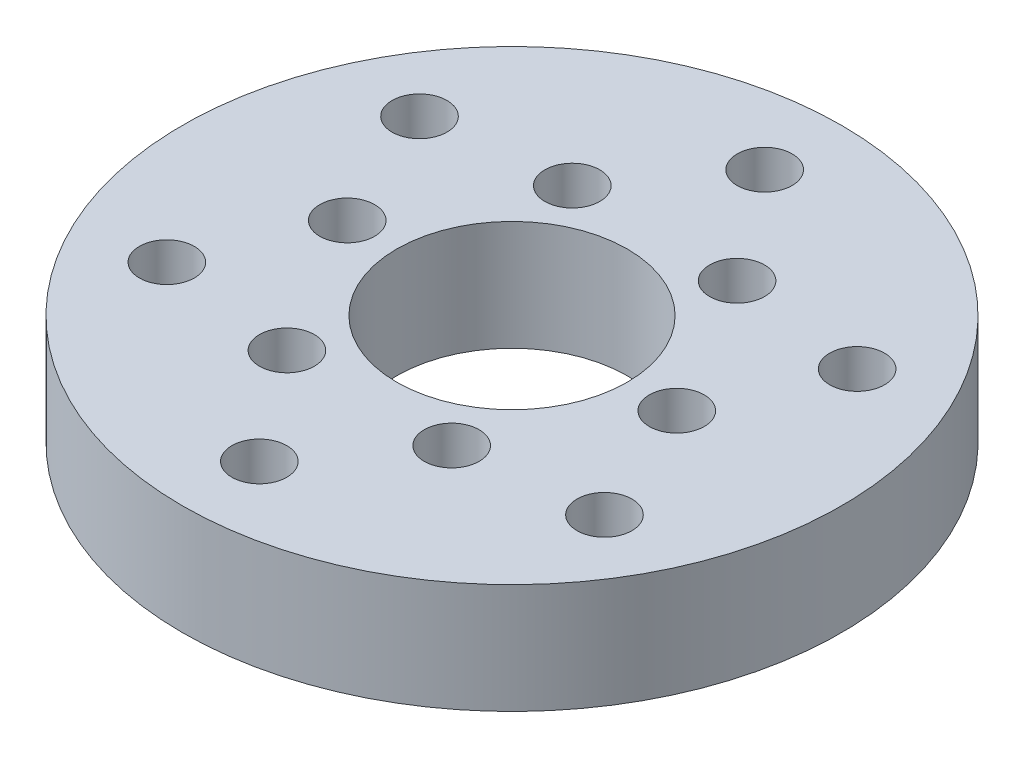
ISO-10303-21;
HEADER;
FILE_DESCRIPTION(('STEP AP214'),'2;1');
FILE_NAME('part.step','',(''),(''),'','','');
FILE_SCHEMA(('AUTOMOTIVE_DESIGN { 1 0 10303 214 1 1 1 1 }'));
ENDSEC;
DATA;
#1=APPLICATION_CONTEXT('core data for automotive mechanical design processes');
#2=APPLICATION_PROTOCOL_DEFINITION('international standard','automotive_design',2000,#1);
#3=PRODUCT_CONTEXT('',#1,'mechanical');
#4=PRODUCT('Part','Part','',(#3));
#5=PRODUCT_RELATED_PRODUCT_CATEGORY('part','',(#4));
#6=PRODUCT_DEFINITION_FORMATION('','',#4);
#7=PRODUCT_DEFINITION_CONTEXT('part definition',#1,'design');
#8=PRODUCT_DEFINITION('design','',#6,#7);
#9=PRODUCT_DEFINITION_SHAPE('','',#8);
#10=(LENGTH_UNIT() NAMED_UNIT(*) SI_UNIT(.MILLI.,.METRE.));
#11=(NAMED_UNIT(*) PLANE_ANGLE_UNIT() SI_UNIT($,.RADIAN.));
#12=(NAMED_UNIT(*) SI_UNIT($,.STERADIAN.) SOLID_ANGLE_UNIT());
#13=UNCERTAINTY_MEASURE_WITH_UNIT(LENGTH_MEASURE(1.E-05),#10,'distance_accuracy_value','');
#14=(GEOMETRIC_REPRESENTATION_CONTEXT(3) GLOBAL_UNCERTAINTY_ASSIGNED_CONTEXT((#13)) GLOBAL_UNIT_ASSIGNED_CONTEXT((#10,
#11,#12)) REPRESENTATION_CONTEXT('',''));
#15=CARTESIAN_POINT('',(0.,0.,0.));
#16=DIRECTION('',(0.,0.,1.));
#17=DIRECTION('',(1.,0.,0.));
#18=AXIS2_PLACEMENT_3D('',#15,#16,#17);
#19=CARTESIAN_POINT('',(0.,10.,0.));
#20=DIRECTION('',(0.,1.,0.));
#21=DIRECTION('',(0.,0.,1.));
#22=AXIS2_PLACEMENT_3D('',#19,#20,#21);
#23=PLANE('',#22);
#24=CARTESIAN_POINT('',(-14.9999999999995,10.,3.01429200709531E-13));
#25=DIRECTION('',(0.,1.,0.));
#26=DIRECTION('',(0.,0.,1.));
#27=AXIS2_PLACEMENT_3D('',#24,#25,#26);
#28=CIRCLE('',#27,2.5);
#29=CARTESIAN_POINT('',(-14.9999999999995,10.,2.5000000000003));
#30=VERTEX_POINT('',#29);
#31=EDGE_CURVE('E92',#30,#30,#28,.T.);
#32=ORIENTED_EDGE('',*,*,#31,.F.);
#33=EDGE_LOOP('',(#32));
#34=FACE_BOUND('',#33,.T.);
#35=CARTESIAN_POINT('',(-7.49999999999893,10.,12.9903810567666));
#36=DIRECTION('',(0.,1.,0.));
#37=DIRECTION('',(0.,0.,1.));
#38=AXIS2_PLACEMENT_3D('',#35,#36,#37);
#39=CIRCLE('',#38,2.5);
#40=CARTESIAN_POINT('',(-7.49999999999893,10.,15.4903810567666));
#41=VERTEX_POINT('',#40);
#42=EDGE_CURVE('E98',#41,#41,#39,.T.);
#43=ORIENTED_EDGE('',*,*,#42,.F.);
#44=EDGE_LOOP('',(#43));
#45=FACE_BOUND('',#44,.T.);
#46=CARTESIAN_POINT('',(7.50000000000108,10.,12.990381056766));
#47=DIRECTION('',(0.,1.,0.));
#48=DIRECTION('',(0.,0.,1.));
#49=AXIS2_PLACEMENT_3D('',#46,#47,#48);
#50=CIRCLE('',#49,2.5);
#51=CARTESIAN_POINT('',(7.50000000000108,10.,15.490381056766));
#52=VERTEX_POINT('',#51);
#53=EDGE_CURVE('E104',#52,#52,#50,.T.);
#54=ORIENTED_EDGE('',*,*,#53,.F.);
#55=EDGE_LOOP('',(#54));
#56=FACE_BOUND('',#55,.T.);
#57=CARTESIAN_POINT('',(15.0000000000006,10.,-9.13786587729344E-13));
#58=DIRECTION('',(0.,1.,0.));
#59=DIRECTION('',(0.,0.,1.));
#60=AXIS2_PLACEMENT_3D('',#57,#58,#59);
#61=CIRCLE('',#60,2.5);
#62=CARTESIAN_POINT('',(15.0000000000006,10.,2.49999999999909));
#63=VERTEX_POINT('',#62);
#64=EDGE_CURVE('E110',#63,#63,#61,.T.);
#65=ORIENTED_EDGE('',*,*,#64,.F.);
#66=EDGE_LOOP('',(#65));
#67=FACE_BOUND('',#66,.T.);
#68=CARTESIAN_POINT('',(7.50000000000003,10.,-12.9903810567672));
#69=DIRECTION('',(0.,1.,0.));
#70=DIRECTION('',(0.,0.,1.));
#71=AXIS2_PLACEMENT_3D('',#68,#69,#70);
#72=CIRCLE('',#71,2.5);
#73=CARTESIAN_POINT('',(7.50000000000003,10.,-10.4903810567672));
#74=VERTEX_POINT('',#73);
#75=EDGE_CURVE('E116',#74,#74,#72,.T.);
#76=ORIENTED_EDGE('',*,*,#75,.F.);
#77=EDGE_LOOP('',(#76));
#78=FACE_BOUND('',#77,.T.);
#79=CARTESIAN_POINT('',(-7.49999999999997,10.,-12.9903810567666));
#80=DIRECTION('',(0.,1.,0.));
#81=DIRECTION('',(0.,0.,1.));
#82=AXIS2_PLACEMENT_3D('',#79,#80,#81);
#83=CIRCLE('',#82,2.5);
#84=CARTESIAN_POINT('',(-7.49999999999997,10.,-10.4903810567666));
#85=VERTEX_POINT('',#84);
#86=EDGE_CURVE('E86',#85,#85,#83,.T.);
#87=ORIENTED_EDGE('',*,*,#86,.F.);
#88=EDGE_LOOP('',(#87));
#89=FACE_BOUND('',#88,.T.);
#90=CARTESIAN_POINT('',(-19.9185842870405,10.,11.5000000000009));
#91=DIRECTION('',(0.,1.,0.));
#92=DIRECTION('',(0.,0.,1.));
#93=AXIS2_PLACEMENT_3D('',#90,#91,#92);
#94=CIRCLE('',#93,2.50000000000087);
#95=CARTESIAN_POINT('',(-19.9185842870405,10.,14.0000000000018));
#96=VERTEX_POINT('',#95);
#97=EDGE_CURVE('E71',#96,#96,#94,.T.);
#98=ORIENTED_EDGE('',*,*,#97,.F.);
#99=EDGE_LOOP('',(#98));
#100=FACE_BOUND('',#99,.T.);
#101=CARTESIAN_POINT('',(19.9185842870437,10.,11.4999999999991));
#102=DIRECTION('',(0.,1.,0.));
#103=DIRECTION('',(0.,0.,1.));
#104=AXIS2_PLACEMENT_3D('',#101,#102,#103);
#105=CIRCLE('',#104,2.50000000000034);
#106=CARTESIAN_POINT('',(19.9185842870437,10.,13.9999999999994));
#107=VERTEX_POINT('',#106);
#108=EDGE_CURVE('E59',#107,#107,#105,.T.);
#109=ORIENTED_EDGE('',*,*,#108,.F.);
#110=EDGE_LOOP('',(#109));
#111=FACE_BOUND('',#110,.T.);
#112=CARTESIAN_POINT('',(0.,10.,0.));
#113=DIRECTION('',(0.,1.,0.));
#114=DIRECTION('',(0.,0.,1.));
#115=AXIS2_PLACEMENT_3D('',#112,#113,#114);
#116=CIRCLE('',#115,10.5);
#117=CARTESIAN_POINT('',(0.,10.,10.5));
#118=VERTEX_POINT('',#117);
#119=EDGE_CURVE('E47',#118,#118,#116,.T.);
#120=ORIENTED_EDGE('',*,*,#119,.F.);
#121=EDGE_LOOP('',(#120));
#122=FACE_BOUND('',#121,.T.);
#123=CARTESIAN_POINT('',(0.,10.,0.));
#124=DIRECTION('',(0.,1.,0.));
#125=DIRECTION('',(0.,0.,1.));
#126=AXIS2_PLACEMENT_3D('',#123,#124,#125);
#127=CIRCLE('',#126,30.);
#128=CARTESIAN_POINT('',(0.,10.,30.));
#129=VERTEX_POINT('',#128);
#130=EDGE_CURVE('E10',#129,#129,#127,.T.);
#131=ORIENTED_EDGE('',*,*,#130,.T.);
#132=EDGE_LOOP('',(#131));
#133=FACE_BOUND('',#132,.T.);
#134=CARTESIAN_POINT('',(0.,10.,-23.));
#135=DIRECTION('',(0.,1.,0.));
#136=DIRECTION('',(0.,0.,1.));
#137=AXIS2_PLACEMENT_3D('',#134,#135,#136);
#138=CIRCLE('',#137,2.5);
#139=CARTESIAN_POINT('',(0.,10.,-20.5));
#140=VERTEX_POINT('',#139);
#141=EDGE_CURVE('E42',#140,#140,#138,.T.);
#142=ORIENTED_EDGE('',*,*,#141,.F.);
#143=EDGE_LOOP('',(#142));
#144=FACE_BOUND('',#143,.T.);
#145=CARTESIAN_POINT('',(19.9185842870426,10.,-11.5000000000009));
#146=DIRECTION('',(0.,1.,0.));
#147=DIRECTION('',(0.,0.,1.));
#148=AXIS2_PLACEMENT_3D('',#145,#146,#147);
#149=CIRCLE('',#148,2.50000000000024);
#150=CARTESIAN_POINT('',(19.9185842870426,10.,-9.0000000000007));
#151=VERTEX_POINT('',#150);
#152=EDGE_CURVE('E53',#151,#151,#149,.T.);
#153=ORIENTED_EDGE('',*,*,#152,.F.);
#154=EDGE_LOOP('',(#153));
#155=FACE_BOUND('',#154,.T.);
#156=CARTESIAN_POINT('',(2.16458606171264E-12,10.,23.));
#157=DIRECTION('',(0.,1.,0.));
#158=DIRECTION('',(0.,0.,1.));
#159=AXIS2_PLACEMENT_3D('',#156,#157,#158);
#160=CIRCLE('',#159,2.50000000000058);
#161=CARTESIAN_POINT('',(2.16458606171264E-12,10.,25.5000000000006));
#162=VERTEX_POINT('',#161);
#163=EDGE_CURVE('E65',#162,#162,#160,.T.);
#164=ORIENTED_EDGE('',*,*,#163,.F.);
#165=EDGE_LOOP('',(#164));
#166=FACE_BOUND('',#165,.T.);
#167=CARTESIAN_POINT('',(-19.9185842870416,10.,-11.499999999999));
#168=DIRECTION('',(0.,1.,0.));
#169=DIRECTION('',(0.,0.,1.));
#170=AXIS2_PLACEMENT_3D('',#167,#168,#169);
#171=CIRCLE('',#170,2.50000000000119);
#172=CARTESIAN_POINT('',(-19.9185842870416,10.,-8.99999999999786));
#173=VERTEX_POINT('',#172);
#174=EDGE_CURVE('E77',#173,#173,#171,.T.);
#175=ORIENTED_EDGE('',*,*,#174,.F.);
#176=EDGE_LOOP('',(#175));
#177=FACE_BOUND('',#176,.T.);
#178=ADVANCED_FACE('F31',(#34,#45,#56,#67,#78,#89,#100,#111,#122,#133,#144,#155,#166,#177),#23,.T.);
#179=CARTESIAN_POINT('',(0.,0.,0.));
#180=DIRECTION('',(0.,1.,0.));
#181=DIRECTION('',(0.,0.,1.));
#182=AXIS2_PLACEMENT_3D('',#179,#180,#181);
#183=PLANE('',#182);
#184=CARTESIAN_POINT('',(-14.9999999999995,0.,3.01429200709531E-13));
#185=DIRECTION('',(0.,1.,0.));
#186=DIRECTION('',(0.,0.,1.));
#187=AXIS2_PLACEMENT_3D('',#184,#185,#186);
#188=CIRCLE('',#187,2.5);
#189=CARTESIAN_POINT('',(-14.9999999999995,0.,2.5000000000003));
#190=VERTEX_POINT('',#189);
#191=EDGE_CURVE('E95',#190,#190,#188,.T.);
#192=ORIENTED_EDGE('',*,*,#191,.T.);
#193=EDGE_LOOP('',(#192));
#194=FACE_BOUND('',#193,.T.);
#195=CARTESIAN_POINT('',(-7.49999999999893,0.,12.9903810567666));
#196=DIRECTION('',(0.,1.,0.));
#197=DIRECTION('',(0.,0.,1.));
#198=AXIS2_PLACEMENT_3D('',#195,#196,#197);
#199=CIRCLE('',#198,2.5);
#200=CARTESIAN_POINT('',(-7.49999999999893,0.,15.4903810567666));
#201=VERTEX_POINT('',#200);
#202=EDGE_CURVE('E101',#201,#201,#199,.T.);
#203=ORIENTED_EDGE('',*,*,#202,.T.);
#204=EDGE_LOOP('',(#203));
#205=FACE_BOUND('',#204,.T.);
#206=CARTESIAN_POINT('',(7.50000000000108,0.,12.990381056766));
#207=DIRECTION('',(0.,1.,0.));
#208=DIRECTION('',(0.,0.,1.));
#209=AXIS2_PLACEMENT_3D('',#206,#207,#208);
#210=CIRCLE('',#209,2.5);
#211=CARTESIAN_POINT('',(7.50000000000108,0.,15.490381056766));
#212=VERTEX_POINT('',#211);
#213=EDGE_CURVE('E107',#212,#212,#210,.T.);
#214=ORIENTED_EDGE('',*,*,#213,.T.);
#215=EDGE_LOOP('',(#214));
#216=FACE_BOUND('',#215,.T.);
#217=CARTESIAN_POINT('',(15.0000000000006,0.,-9.13786587729344E-13));
#218=DIRECTION('',(0.,1.,0.));
#219=DIRECTION('',(0.,0.,1.));
#220=AXIS2_PLACEMENT_3D('',#217,#218,#219);
#221=CIRCLE('',#220,2.5);
#222=CARTESIAN_POINT('',(15.0000000000006,0.,2.49999999999909));
#223=VERTEX_POINT('',#222);
#224=EDGE_CURVE('E113',#223,#223,#221,.T.);
#225=ORIENTED_EDGE('',*,*,#224,.T.);
#226=EDGE_LOOP('',(#225));
#227=FACE_BOUND('',#226,.T.);
#228=CARTESIAN_POINT('',(7.50000000000003,0.,-12.9903810567672));
#229=DIRECTION('',(0.,1.,0.));
#230=DIRECTION('',(0.,0.,1.));
#231=AXIS2_PLACEMENT_3D('',#228,#229,#230);
#232=CIRCLE('',#231,2.5);
#233=CARTESIAN_POINT('',(7.50000000000003,0.,-10.4903810567672));
#234=VERTEX_POINT('',#233);
#235=EDGE_CURVE('E89',#234,#234,#232,.T.);
#236=ORIENTED_EDGE('',*,*,#235,.T.);
#237=EDGE_LOOP('',(#236));
#238=FACE_BOUND('',#237,.T.);
#239=CARTESIAN_POINT('',(-7.49999999999997,0.,-12.9903810567666));
#240=DIRECTION('',(0.,1.,0.));
#241=DIRECTION('',(0.,0.,1.));
#242=AXIS2_PLACEMENT_3D('',#239,#240,#241);
#243=CIRCLE('',#242,2.5);
#244=CARTESIAN_POINT('',(-7.49999999999997,0.,-10.4903810567666));
#245=VERTEX_POINT('',#244);
#246=EDGE_CURVE('E83',#245,#245,#243,.T.);
#247=ORIENTED_EDGE('',*,*,#246,.T.);
#248=EDGE_LOOP('',(#247));
#249=FACE_BOUND('',#248,.T.);
#250=CARTESIAN_POINT('',(0.,0.,0.));
#251=DIRECTION('',(0.,1.,0.));
#252=DIRECTION('',(0.,0.,1.));
#253=AXIS2_PLACEMENT_3D('',#250,#251,#252);
#254=CIRCLE('',#253,30.);
#255=CARTESIAN_POINT('',(0.,0.,30.));
#256=VERTEX_POINT('',#255);
#257=EDGE_CURVE('E35',#256,#256,#254,.T.);
#258=ORIENTED_EDGE('',*,*,#257,.F.);
#259=EDGE_LOOP('',(#258));
#260=FACE_BOUND('',#259,.T.);
#261=CARTESIAN_POINT('',(0.,0.,-23.));
#262=DIRECTION('',(0.,1.,0.));
#263=DIRECTION('',(0.,0.,1.));
#264=AXIS2_PLACEMENT_3D('',#261,#262,#263);
#265=CIRCLE('',#264,2.5);
#266=CARTESIAN_POINT('',(0.,0.,-20.5));
#267=VERTEX_POINT('',#266);
#268=EDGE_CURVE('E44',#267,#267,#265,.T.);
#269=ORIENTED_EDGE('',*,*,#268,.T.);
#270=EDGE_LOOP('',(#269));
#271=FACE_BOUND('',#270,.T.);
#272=CARTESIAN_POINT('',(0.,0.,0.));
#273=DIRECTION('',(0.,1.,0.));
#274=DIRECTION('',(0.,0.,1.));
#275=AXIS2_PLACEMENT_3D('',#272,#273,#274);
#276=CIRCLE('',#275,10.5);
#277=CARTESIAN_POINT('',(0.,0.,10.5));
#278=VERTEX_POINT('',#277);
#279=EDGE_CURVE('E50',#278,#278,#276,.T.);
#280=ORIENTED_EDGE('',*,*,#279,.T.);
#281=EDGE_LOOP('',(#280));
#282=FACE_BOUND('',#281,.T.);
#283=CARTESIAN_POINT('',(19.9185842870426,0.,-11.5000000000009));
#284=DIRECTION('',(0.,1.,0.));
#285=DIRECTION('',(0.,0.,1.));
#286=AXIS2_PLACEMENT_3D('',#283,#284,#285);
#287=CIRCLE('',#286,2.50000000000024);
#288=CARTESIAN_POINT('',(19.9185842870426,0.,-9.0000000000007));
#289=VERTEX_POINT('',#288);
#290=EDGE_CURVE('E56',#289,#289,#287,.T.);
#291=ORIENTED_EDGE('',*,*,#290,.T.);
#292=EDGE_LOOP('',(#291));
#293=FACE_BOUND('',#292,.T.);
#294=CARTESIAN_POINT('',(19.9185842870437,0.,11.4999999999991));
#295=DIRECTION('',(0.,1.,0.));
#296=DIRECTION('',(0.,0.,1.));
#297=AXIS2_PLACEMENT_3D('',#294,#295,#296);
#298=CIRCLE('',#297,2.50000000000034);
#299=CARTESIAN_POINT('',(19.9185842870437,0.,13.9999999999994));
#300=VERTEX_POINT('',#299);
#301=EDGE_CURVE('E62',#300,#300,#298,.T.);
#302=ORIENTED_EDGE('',*,*,#301,.T.);
#303=EDGE_LOOP('',(#302));
#304=FACE_BOUND('',#303,.T.);
#305=CARTESIAN_POINT('',(2.16458606171264E-12,0.,23.));
#306=DIRECTION('',(0.,1.,0.));
#307=DIRECTION('',(0.,0.,1.));
#308=AXIS2_PLACEMENT_3D('',#305,#306,#307);
#309=CIRCLE('',#308,2.50000000000058);
#310=CARTESIAN_POINT('',(2.16458606171264E-12,0.,25.5000000000006));
#311=VERTEX_POINT('',#310);
#312=EDGE_CURVE('E68',#311,#311,#309,.T.);
#313=ORIENTED_EDGE('',*,*,#312,.T.);
#314=EDGE_LOOP('',(#313));
#315=FACE_BOUND('',#314,.T.);
#316=CARTESIAN_POINT('',(-19.9185842870405,0.,11.5000000000009));
#317=DIRECTION('',(0.,1.,0.));
#318=DIRECTION('',(0.,0.,1.));
#319=AXIS2_PLACEMENT_3D('',#316,#317,#318);
#320=CIRCLE('',#319,2.50000000000087);
#321=CARTESIAN_POINT('',(-19.9185842870405,0.,14.0000000000018));
#322=VERTEX_POINT('',#321);
#323=EDGE_CURVE('E74',#322,#322,#320,.T.);
#324=ORIENTED_EDGE('',*,*,#323,.T.);
#325=EDGE_LOOP('',(#324));
#326=FACE_BOUND('',#325,.T.);
#327=CARTESIAN_POINT('',(-19.9185842870416,0.,-11.499999999999));
#328=DIRECTION('',(0.,1.,0.));
#329=DIRECTION('',(0.,0.,1.));
#330=AXIS2_PLACEMENT_3D('',#327,#328,#329);
#331=CIRCLE('',#330,2.50000000000119);
#332=CARTESIAN_POINT('',(-19.9185842870416,0.,-8.99999999999786));
#333=VERTEX_POINT('',#332);
#334=EDGE_CURVE('E80',#333,#333,#331,.T.);
#335=ORIENTED_EDGE('',*,*,#334,.T.);
#336=EDGE_LOOP('',(#335));
#337=FACE_BOUND('',#336,.T.);
#338=ADVANCED_FACE('F122',(#194,#205,#216,#227,#238,#249,#260,#271,#282,#293,#304,#315,#326,
#337),#183,.F.);
#339=CARTESIAN_POINT('',(0.,10.,0.));
#340=DIRECTION('',(0.,-1.,0.));
#341=DIRECTION('',(0.,0.,-1.));
#342=AXIS2_PLACEMENT_3D('',#339,#340,#341);
#343=CYLINDRICAL_SURFACE('',#342,30.);
#344=ORIENTED_EDGE('',*,*,#130,.F.);
#345=EDGE_LOOP('',(#344));
#346=FACE_BOUND('',#345,.T.);
#347=ORIENTED_EDGE('',*,*,#257,.T.);
#348=EDGE_LOOP('',(#347));
#349=FACE_BOUND('',#348,.T.);
#350=ADVANCED_FACE('F33',(#346,#349),#343,.T.);
#351=CARTESIAN_POINT('',(0.,10.,-23.));
#352=DIRECTION('',(0.,-1.,0.));
#353=DIRECTION('',(0.,0.,-1.));
#354=AXIS2_PLACEMENT_3D('',#351,#352,#353);
#355=CYLINDRICAL_SURFACE('',#354,2.5);
#356=ORIENTED_EDGE('',*,*,#141,.T.);
#357=EDGE_LOOP('',(#356));
#358=FACE_BOUND('',#357,.T.);
#359=ORIENTED_EDGE('',*,*,#268,.F.);
#360=EDGE_LOOP('',(#359));
#361=FACE_BOUND('',#360,.T.);
#362=ADVANCED_FACE('F166',(#358,#361),#355,.F.);
#363=CARTESIAN_POINT('',(0.,10.,0.));
#364=DIRECTION('',(0.,-1.,0.));
#365=DIRECTION('',(0.,0.,-1.));
#366=AXIS2_PLACEMENT_3D('',#363,#364,#365);
#367=CYLINDRICAL_SURFACE('',#366,10.5);
#368=ORIENTED_EDGE('',*,*,#119,.T.);
#369=EDGE_LOOP('',(#368));
#370=FACE_BOUND('',#369,.T.);
#371=ORIENTED_EDGE('',*,*,#279,.F.);
#372=EDGE_LOOP('',(#371));
#373=FACE_BOUND('',#372,.T.);
#374=ADVANCED_FACE('F172',(#370,#373),#367,.F.);
#375=CARTESIAN_POINT('',(19.9185842870426,10.,-11.5000000000009));
#376=DIRECTION('',(0.,-1.,0.));
#377=DIRECTION('',(0.,0.,-1.));
#378=AXIS2_PLACEMENT_3D('',#375,#376,#377);
#379=CYLINDRICAL_SURFACE('',#378,2.50000000000024);
#380=ORIENTED_EDGE('',*,*,#152,.T.);
#381=EDGE_LOOP('',(#380));
#382=FACE_BOUND('',#381,.T.);
#383=ORIENTED_EDGE('',*,*,#290,.F.);
#384=EDGE_LOOP('',(#383));
#385=FACE_BOUND('',#384,.T.);
#386=ADVANCED_FACE('F176',(#382,#385),#379,.F.);
#387=CARTESIAN_POINT('',(19.9185842870437,10.,11.4999999999991));
#388=DIRECTION('',(0.,-1.,0.));
#389=DIRECTION('',(0.,0.,-1.));
#390=AXIS2_PLACEMENT_3D('',#387,#388,#389);
#391=CYLINDRICAL_SURFACE('',#390,2.50000000000034);
#392=ORIENTED_EDGE('',*,*,#108,.T.);
#393=EDGE_LOOP('',(#392));
#394=FACE_BOUND('',#393,.T.);
#395=ORIENTED_EDGE('',*,*,#301,.F.);
#396=EDGE_LOOP('',(#395));
#397=FACE_BOUND('',#396,.T.);
#398=ADVANCED_FACE('F180',(#394,#397),#391,.F.);
#399=CARTESIAN_POINT('',(2.16458606171264E-12,10.,23.));
#400=DIRECTION('',(0.,-1.,0.));
#401=DIRECTION('',(0.,0.,-1.));
#402=AXIS2_PLACEMENT_3D('',#399,#400,#401);
#403=CYLINDRICAL_SURFACE('',#402,2.50000000000058);
#404=ORIENTED_EDGE('',*,*,#163,.T.);
#405=EDGE_LOOP('',(#404));
#406=FACE_BOUND('',#405,.T.);
#407=ORIENTED_EDGE('',*,*,#312,.F.);
#408=EDGE_LOOP('',(#407));
#409=FACE_BOUND('',#408,.T.);
#410=ADVANCED_FACE('F184',(#406,#409),#403,.F.);
#411=CARTESIAN_POINT('',(-19.9185842870405,10.,11.5000000000009));
#412=DIRECTION('',(0.,-1.,0.));
#413=DIRECTION('',(0.,0.,-1.));
#414=AXIS2_PLACEMENT_3D('',#411,#412,#413);
#415=CYLINDRICAL_SURFACE('',#414,2.50000000000087);
#416=ORIENTED_EDGE('',*,*,#97,.T.);
#417=EDGE_LOOP('',(#416));
#418=FACE_BOUND('',#417,.T.);
#419=ORIENTED_EDGE('',*,*,#323,.F.);
#420=EDGE_LOOP('',(#419));
#421=FACE_BOUND('',#420,.T.);
#422=ADVANCED_FACE('F156',(#418,#421),#415,.F.);
#423=CARTESIAN_POINT('',(-19.9185842870416,10.,-11.499999999999));
#424=DIRECTION('',(0.,-1.,0.));
#425=DIRECTION('',(0.,0.,-1.));
#426=AXIS2_PLACEMENT_3D('',#423,#424,#425);
#427=CYLINDRICAL_SURFACE('',#426,2.50000000000119);
#428=ORIENTED_EDGE('',*,*,#174,.T.);
#429=EDGE_LOOP('',(#428));
#430=FACE_BOUND('',#429,.T.);
#431=ORIENTED_EDGE('',*,*,#334,.F.);
#432=EDGE_LOOP('',(#431));
#433=FACE_BOUND('',#432,.T.);
#434=ADVANCED_FACE('F153',(#430,#433),#427,.F.);
#435=CARTESIAN_POINT('',(-7.49999999999997,0.,-12.9903810567666));
#436=DIRECTION('',(0.,1.,0.));
#437=DIRECTION('',(0.,0.,1.));
#438=AXIS2_PLACEMENT_3D('',#435,#436,#437);
#439=CYLINDRICAL_SURFACE('',#438,2.5);
#440=ORIENTED_EDGE('',*,*,#246,.F.);
#441=EDGE_LOOP('',(#440));
#442=FACE_BOUND('',#441,.T.);
#443=ORIENTED_EDGE('',*,*,#86,.T.);
#444=EDGE_LOOP('',(#443));
#445=FACE_BOUND('',#444,.T.);
#446=ADVANCED_FACE('F129',(#442,#445),#439,.F.);
#447=CARTESIAN_POINT('',(7.50000000000003,0.,-12.9903810567672));
#448=DIRECTION('',(0.,1.,0.));
#449=DIRECTION('',(0.,0.,1.));
#450=AXIS2_PLACEMENT_3D('',#447,#448,#449);
#451=CYLINDRICAL_SURFACE('',#450,2.5);
#452=ORIENTED_EDGE('',*,*,#235,.F.);
#453=EDGE_LOOP('',(#452));
#454=FACE_BOUND('',#453,.T.);
#455=ORIENTED_EDGE('',*,*,#75,.T.);
#456=EDGE_LOOP('',(#455));
#457=FACE_BOUND('',#456,.T.);
#458=ADVANCED_FACE('F125',(#454,#457),#451,.F.);
#459=CARTESIAN_POINT('',(15.0000000000006,0.,-9.13786587729344E-13));
#460=DIRECTION('',(0.,1.,0.));
#461=DIRECTION('',(0.,0.,1.));
#462=AXIS2_PLACEMENT_3D('',#459,#460,#461);
#463=CYLINDRICAL_SURFACE('',#462,2.5);
#464=ORIENTED_EDGE('',*,*,#224,.F.);
#465=EDGE_LOOP('',(#464));
#466=FACE_BOUND('',#465,.T.);
#467=ORIENTED_EDGE('',*,*,#64,.T.);
#468=EDGE_LOOP('',(#467));
#469=FACE_BOUND('',#468,.T.);
#470=ADVANCED_FACE('F128',(#466,#469),#463,.F.);
#471=CARTESIAN_POINT('',(7.50000000000108,0.,12.990381056766));
#472=DIRECTION('',(0.,1.,0.));
#473=DIRECTION('',(0.,0.,1.));
#474=AXIS2_PLACEMENT_3D('',#471,#472,#473);
#475=CYLINDRICAL_SURFACE('',#474,2.5);
#476=ORIENTED_EDGE('',*,*,#213,.F.);
#477=EDGE_LOOP('',(#476));
#478=FACE_BOUND('',#477,.T.);
#479=ORIENTED_EDGE('',*,*,#53,.T.);
#480=EDGE_LOOP('',(#479));
#481=FACE_BOUND('',#480,.T.);
#482=ADVANCED_FACE('F202',(#478,#481),#475,.F.);
#483=CARTESIAN_POINT('',(-7.49999999999893,0.,12.9903810567666));
#484=DIRECTION('',(0.,1.,0.));
#485=DIRECTION('',(0.,0.,1.));
#486=AXIS2_PLACEMENT_3D('',#483,#484,#485);
#487=CYLINDRICAL_SURFACE('',#486,2.5);
#488=ORIENTED_EDGE('',*,*,#202,.F.);
#489=EDGE_LOOP('',(#488));
#490=FACE_BOUND('',#489,.T.);
#491=ORIENTED_EDGE('',*,*,#42,.T.);
#492=EDGE_LOOP('',(#491));
#493=FACE_BOUND('',#492,.T.);
#494=ADVANCED_FACE('F198',(#490,#493),#487,.F.);
#495=CARTESIAN_POINT('',(-14.9999999999995,0.,3.01429200709531E-13));
#496=DIRECTION('',(0.,1.,0.));
#497=DIRECTION('',(0.,0.,1.));
#498=AXIS2_PLACEMENT_3D('',#495,#496,#497);
#499=CYLINDRICAL_SURFACE('',#498,2.5);
#500=ORIENTED_EDGE('',*,*,#191,.F.);
#501=EDGE_LOOP('',(#500));
#502=FACE_BOUND('',#501,.T.);
#503=ORIENTED_EDGE('',*,*,#31,.T.);
#504=EDGE_LOOP('',(#503));
#505=FACE_BOUND('',#504,.T.);
#506=ADVANCED_FACE('F195',(#502,#505),#499,.F.);
#507=CLOSED_SHELL('',(#178,#338,#350,#362,#374,#386,#398,#410,#422,#434,#446,#458,#470,#482,
#494,#506));
#508=MANIFOLD_SOLID_BREP('B2',#507);
#509=ADVANCED_BREP_SHAPE_REPRESENTATION('',(#18,#508),#14);
#510=SHAPE_DEFINITION_REPRESENTATION(#9,#509);
ENDSEC;
END-ISO-10303-21;
